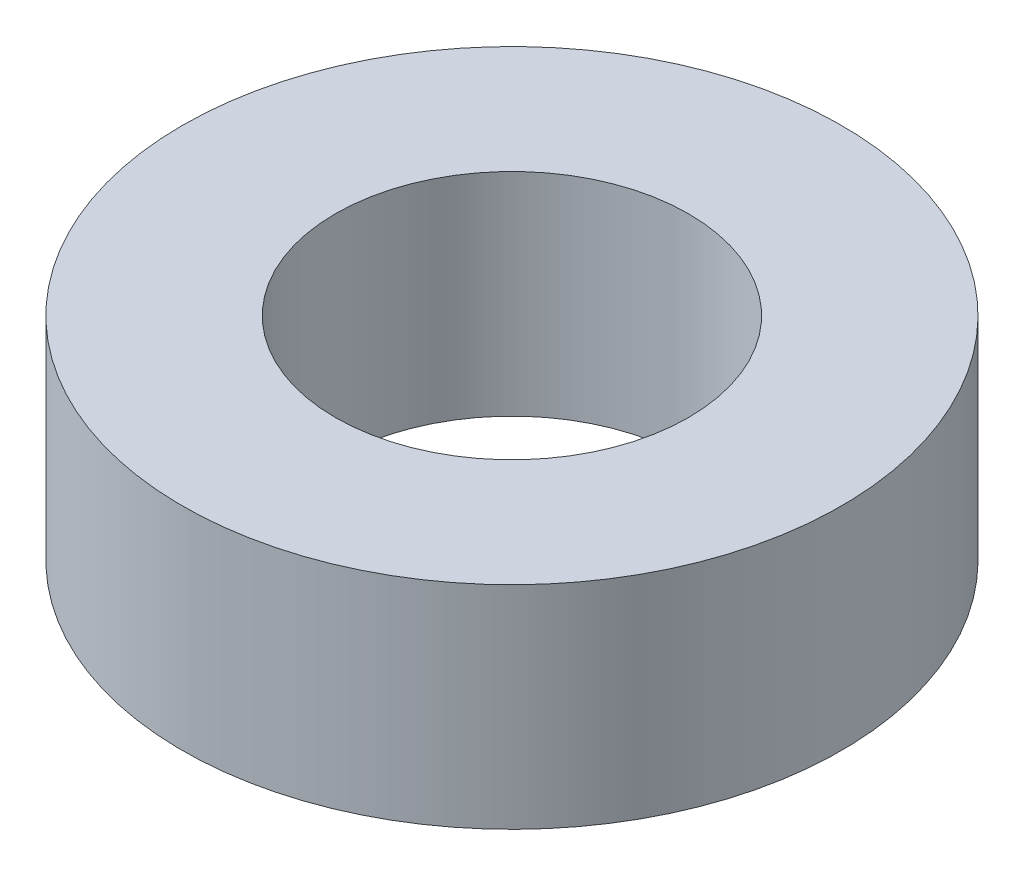
ISO-10303-21;
HEADER;
FILE_DESCRIPTION(('STEP AP214'),'2;1');
FILE_NAME('part.step','',(''),(''),'','','');
FILE_SCHEMA(('AUTOMOTIVE_DESIGN { 1 0 10303 214 1 1 1 1 }'));
ENDSEC;
DATA;
#1=APPLICATION_CONTEXT('core data for automotive mechanical design processes');
#2=APPLICATION_PROTOCOL_DEFINITION('international standard','automotive_design',2000,#1);
#3=PRODUCT_CONTEXT('',#1,'mechanical');
#4=PRODUCT('Part','Part','',(#3));
#5=PRODUCT_RELATED_PRODUCT_CATEGORY('part','',(#4));
#6=PRODUCT_DEFINITION_FORMATION('','',#4);
#7=PRODUCT_DEFINITION_CONTEXT('part definition',#1,'design');
#8=PRODUCT_DEFINITION('design','',#6,#7);
#9=PRODUCT_DEFINITION_SHAPE('','',#8);
#10=(LENGTH_UNIT() NAMED_UNIT(*) SI_UNIT(.MILLI.,.METRE.));
#11=(NAMED_UNIT(*) PLANE_ANGLE_UNIT() SI_UNIT($,.RADIAN.));
#12=(NAMED_UNIT(*) SI_UNIT($,.STERADIAN.) SOLID_ANGLE_UNIT());
#13=UNCERTAINTY_MEASURE_WITH_UNIT(LENGTH_MEASURE(1.E-05),#10,'distance_accuracy_value','');
#14=(GEOMETRIC_REPRESENTATION_CONTEXT(3) GLOBAL_UNCERTAINTY_ASSIGNED_CONTEXT((#13)) GLOBAL_UNIT_ASSIGNED_CONTEXT((#10,
#11,#12)) REPRESENTATION_CONTEXT('',''));
#15=CARTESIAN_POINT('',(0.,0.,0.));
#16=DIRECTION('',(0.,0.,1.));
#17=DIRECTION('',(1.,0.,0.));
#18=AXIS2_PLACEMENT_3D('',#15,#16,#17);
#19=CARTESIAN_POINT('',(0.,0.,0.));
#20=DIRECTION('',(0.,1.,0.));
#21=DIRECTION('',(1.,0.,0.));
#22=AXIS2_PLACEMENT_3D('',#19,#20,#21);
#23=PLANE('',#22);
#24=CARTESIAN_POINT('',(0.,0.,0.));
#25=DIRECTION('',(0.,-1.,0.));
#26=DIRECTION('',(1.,0.,0.));
#27=AXIS2_PLACEMENT_3D('',#24,#25,#26);
#28=CIRCLE('',#27,7.5);
#29=CARTESIAN_POINT('',(-7.5,0.,0.));
#30=VERTEX_POINT('',#29);
#31=EDGE_CURVE('E49',#30,#30,#28,.T.);
#32=ORIENTED_EDGE('',*,*,#31,.F.);
#33=EDGE_LOOP('',(#32));
#34=FACE_BOUND('',#33,.T.);
#35=CARTESIAN_POINT('',(0.,0.,0.));
#36=DIRECTION('',(0.,1.,0.));
#37=DIRECTION('',(1.,0.,0.));
#38=AXIS2_PLACEMENT_3D('',#35,#36,#37);
#39=CIRCLE('',#38,14.);
#40=CARTESIAN_POINT('',(-14.,0.,0.));
#41=VERTEX_POINT('',#40);
#42=EDGE_CURVE('E11',#41,#41,#39,.T.);
#43=ORIENTED_EDGE('',*,*,#42,.F.);
#44=EDGE_LOOP('',(#43));
#45=FACE_BOUND('',#44,.T.);
#46=ADVANCED_FACE('F17',(#34,#45),#23,.F.);
#47=CARTESIAN_POINT('',(0.,9.,0.));
#48=DIRECTION('',(0.,1.,0.));
#49=DIRECTION('',(1.,0.,0.));
#50=AXIS2_PLACEMENT_3D('',#47,#48,#49);
#51=PLANE('',#50);
#52=CARTESIAN_POINT('',(0.,9.,0.));
#53=DIRECTION('',(0.,-1.,0.));
#54=DIRECTION('',(1.,0.,0.));
#55=AXIS2_PLACEMENT_3D('',#52,#53,#54);
#56=CIRCLE('',#55,7.5);
#57=CARTESIAN_POINT('',(-7.5,9.,0.));
#58=VERTEX_POINT('',#57);
#59=EDGE_CURVE('E64',#58,#58,#56,.T.);
#60=ORIENTED_EDGE('',*,*,#59,.T.);
#61=EDGE_LOOP('',(#60));
#62=FACE_BOUND('',#61,.T.);
#63=CARTESIAN_POINT('',(0.,9.,0.));
#64=DIRECTION('',(0.,1.,0.));
#65=DIRECTION('',(1.,0.,0.));
#66=AXIS2_PLACEMENT_3D('',#63,#64,#65);
#67=CIRCLE('',#66,14.);
#68=CARTESIAN_POINT('',(-14.,9.,0.));
#69=VERTEX_POINT('',#68);
#70=EDGE_CURVE('E55',#69,#69,#67,.T.);
#71=ORIENTED_EDGE('',*,*,#70,.T.);
#72=EDGE_LOOP('',(#71));
#73=FACE_BOUND('',#72,.T.);
#74=ADVANCED_FACE('F71',(#62,#73),#51,.T.);
#75=CARTESIAN_POINT('',(0.,0.,0.));
#76=DIRECTION('',(0.,1.,0.));
#77=DIRECTION('',(1.,0.,0.));
#78=AXIS2_PLACEMENT_3D('',#75,#76,#77);
#79=CYLINDRICAL_SURFACE('',#78,14.);
#80=ORIENTED_EDGE('',*,*,#70,.F.);
#81=DIRECTION('',(0.,-1.,0.));
#82=VECTOR('',#81,1.);
#83=CARTESIAN_POINT('',(-14.,0.,0.));
#84=LINE('',#83,#82);
#85=EDGE_CURVE('E27',#69,#41,#84,.T.);
#86=ORIENTED_EDGE('',*,*,#85,.T.);
#87=ORIENTED_EDGE('',*,*,#42,.T.);
#88=ORIENTED_EDGE('',*,*,#85,.F.);
#89=EDGE_LOOP('',(#80,#86,#87,#88));
#90=FACE_BOUND('',#89,.T.);
#91=ADVANCED_FACE('F74',(#90),#79,.T.);
#92=CARTESIAN_POINT('',(0.,0.,0.));
#93=DIRECTION('',(0.,1.,0.));
#94=DIRECTION('',(1.,0.,0.));
#95=AXIS2_PLACEMENT_3D('',#92,#93,#94);
#96=CYLINDRICAL_SURFACE('',#95,7.5);
#97=ORIENTED_EDGE('',*,*,#59,.F.);
#98=DIRECTION('',(0.,-1.,0.));
#99=VECTOR('',#98,1.);
#100=CARTESIAN_POINT('',(-7.5,0.,0.));
#101=LINE('',#100,#99);
#102=EDGE_CURVE('E51',#58,#30,#101,.T.);
#103=ORIENTED_EDGE('',*,*,#102,.T.);
#104=ORIENTED_EDGE('',*,*,#31,.T.);
#105=ORIENTED_EDGE('',*,*,#102,.F.);
#106=EDGE_LOOP('',(#97,#103,#104,#105));
#107=FACE_BOUND('',#106,.T.);
#108=ADVANCED_FACE('F19',(#107),#96,.F.);
#109=CLOSED_SHELL('',(#46,#74,#91,#108));
#110=MANIFOLD_SOLID_BREP('B1',#109);
#111=ADVANCED_BREP_SHAPE_REPRESENTATION('',(#18,#110),#14);
#112=SHAPE_DEFINITION_REPRESENTATION(#9,#111);
ENDSEC;
END-ISO-10303-21;
